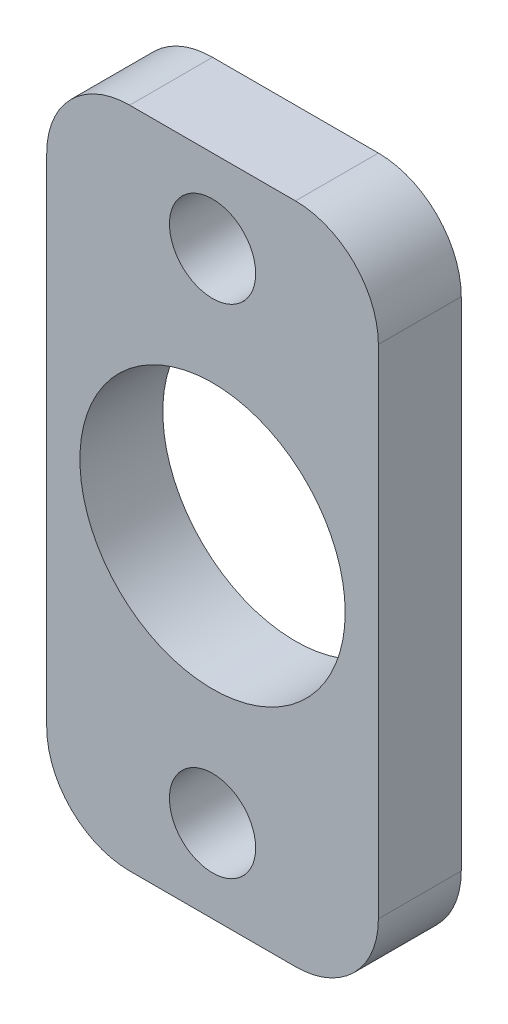
ISO-10303-21;
HEADER;
FILE_DESCRIPTION(('STEP AP214'),'2;1');
FILE_NAME('part.step','',(''),(''),'','','');
FILE_SCHEMA(('AUTOMOTIVE_DESIGN { 1 0 10303 214 1 1 1 1 }'));
ENDSEC;
DATA;
#1=APPLICATION_CONTEXT('core data for automotive mechanical design processes');
#2=APPLICATION_PROTOCOL_DEFINITION('international standard','automotive_design',2000,#1);
#3=PRODUCT_CONTEXT('',#1,'mechanical');
#4=PRODUCT('Part','Part','',(#3));
#5=PRODUCT_RELATED_PRODUCT_CATEGORY('part','',(#4));
#6=PRODUCT_DEFINITION_FORMATION('','',#4);
#7=PRODUCT_DEFINITION_CONTEXT('part definition',#1,'design');
#8=PRODUCT_DEFINITION('design','',#6,#7);
#9=PRODUCT_DEFINITION_SHAPE('','',#8);
#10=(LENGTH_UNIT() NAMED_UNIT(*) SI_UNIT(.MILLI.,.METRE.));
#11=(NAMED_UNIT(*) PLANE_ANGLE_UNIT() SI_UNIT($,.RADIAN.));
#12=(NAMED_UNIT(*) SI_UNIT($,.STERADIAN.) SOLID_ANGLE_UNIT());
#13=UNCERTAINTY_MEASURE_WITH_UNIT(LENGTH_MEASURE(1.E-05),#10,'distance_accuracy_value','');
#14=(GEOMETRIC_REPRESENTATION_CONTEXT(3) GLOBAL_UNCERTAINTY_ASSIGNED_CONTEXT((#13)) GLOBAL_UNIT_ASSIGNED_CONTEXT((#10,
#11,#12)) REPRESENTATION_CONTEXT('',''));
#15=CARTESIAN_POINT('',(0.,0.,0.));
#16=DIRECTION('',(0.,0.,1.));
#17=DIRECTION('',(1.,0.,0.));
#18=AXIS2_PLACEMENT_3D('',#15,#16,#17);
#19=CARTESIAN_POINT('',(0.,0.,2.5));
#20=DIRECTION('',(0.,0.,1.));
#21=DIRECTION('',(1.,0.,0.));
#22=AXIS2_PLACEMENT_3D('',#19,#20,#21);
#23=PLANE('',#22);
#24=CARTESIAN_POINT('',(0.,15.,2.5));
#25=DIRECTION('',(0.,0.,-1.));
#26=DIRECTION('',(1.,0.,0.));
#27=AXIS2_PLACEMENT_3D('',#24,#25,#26);
#28=CIRCLE('',#27,2.6);
#29=CARTESIAN_POINT('',(2.6,15.,2.5));
#30=VERTEX_POINT('',#29);
#31=EDGE_CURVE('E183',#30,#30,#28,.T.);
#32=ORIENTED_EDGE('',*,*,#31,.T.);
#33=EDGE_LOOP('',(#32));
#34=FACE_BOUND('',#33,.T.);
#35=CARTESIAN_POINT('',(0.,-15.,2.5));
#36=DIRECTION('',(0.,0.,1.));
#37=DIRECTION('',(1.,0.,0.));
#38=AXIS2_PLACEMENT_3D('',#35,#36,#37);
#39=CIRCLE('',#38,2.6);
#40=CARTESIAN_POINT('',(2.6,-15.,2.5));
#41=VERTEX_POINT('',#40);
#42=EDGE_CURVE('E177',#41,#41,#39,.T.);
#43=ORIENTED_EDGE('',*,*,#42,.F.);
#44=EDGE_LOOP('',(#43));
#45=FACE_BOUND('',#44,.T.);
#46=DIRECTION('',(0.,-1.,0.));
#47=VECTOR('',#46,1.);
#48=CARTESIAN_POINT('',(-10.,20.,2.5));
#49=LINE('',#48,#47);
#50=CARTESIAN_POINT('',(-10.,15.,2.5));
#51=VERTEX_POINT('',#50);
#52=CARTESIAN_POINT('',(-10.,-15.,2.5));
#53=VERTEX_POINT('',#52);
#54=EDGE_CURVE('E170',#51,#53,#49,.T.);
#55=ORIENTED_EDGE('',*,*,#54,.T.);
#56=CARTESIAN_POINT('',(-5.,-15.,2.5));
#57=DIRECTION('',(0.,0.,1.));
#58=DIRECTION('',(1.,0.,0.));
#59=AXIS2_PLACEMENT_3D('',#56,#57,#58);
#60=CIRCLE('',#59,5.);
#61=CARTESIAN_POINT('',(-5.,-20.,2.5));
#62=VERTEX_POINT('',#61);
#63=EDGE_CURVE('E147',#53,#62,#60,.T.);
#64=ORIENTED_EDGE('',*,*,#63,.T.);
#65=DIRECTION('',(1.,0.,0.));
#66=VECTOR('',#65,1.);
#67=CARTESIAN_POINT('',(-10.,-20.,2.5));
#68=LINE('',#67,#66);
#69=CARTESIAN_POINT('',(5.,-20.,2.5));
#70=VERTEX_POINT('',#69);
#71=EDGE_CURVE('E118',#62,#70,#68,.T.);
#72=ORIENTED_EDGE('',*,*,#71,.T.);
#73=CARTESIAN_POINT('',(5.,-15.,2.5));
#74=DIRECTION('',(0.,0.,1.));
#75=DIRECTION('',(1.,0.,0.));
#76=AXIS2_PLACEMENT_3D('',#73,#74,#75);
#77=CIRCLE('',#76,5.);
#78=CARTESIAN_POINT('',(10.,-15.,2.5));
#79=VERTEX_POINT('',#78);
#80=EDGE_CURVE('E142',#70,#79,#77,.T.);
#81=ORIENTED_EDGE('',*,*,#80,.T.);
#82=DIRECTION('',(0.,1.,0.));
#83=VECTOR('',#82,1.);
#84=CARTESIAN_POINT('',(10.,20.,2.5));
#85=LINE('',#84,#83);
#86=CARTESIAN_POINT('',(10.,15.,2.5));
#87=VERTEX_POINT('',#86);
#88=EDGE_CURVE('E125',#79,#87,#85,.T.);
#89=ORIENTED_EDGE('',*,*,#88,.T.);
#90=CARTESIAN_POINT('',(5.,15.,2.5));
#91=DIRECTION('',(0.,0.,1.));
#92=DIRECTION('',(1.,0.,0.));
#93=AXIS2_PLACEMENT_3D('',#90,#91,#92);
#94=CIRCLE('',#93,5.);
#95=CARTESIAN_POINT('',(5.,20.,2.5));
#96=VERTEX_POINT('',#95);
#97=EDGE_CURVE('E54',#87,#96,#94,.T.);
#98=ORIENTED_EDGE('',*,*,#97,.T.);
#99=DIRECTION('',(-1.,0.,0.));
#100=VECTOR('',#99,1.);
#101=CARTESIAN_POINT('',(-10.,20.,2.5));
#102=LINE('',#101,#100);
#103=CARTESIAN_POINT('',(-5.,20.,2.5));
#104=VERTEX_POINT('',#103);
#105=EDGE_CURVE('E128',#96,#104,#102,.T.);
#106=ORIENTED_EDGE('',*,*,#105,.T.);
#107=CARTESIAN_POINT('',(-5.,15.,2.5));
#108=DIRECTION('',(0.,0.,1.));
#109=DIRECTION('',(1.,0.,0.));
#110=AXIS2_PLACEMENT_3D('',#107,#108,#109);
#111=CIRCLE('',#110,5.);
#112=EDGE_CURVE('E145',#104,#51,#111,.T.);
#113=ORIENTED_EDGE('',*,*,#112,.T.);
#114=EDGE_LOOP('',(#55,#64,#72,#81,#89,#98,#106,#113));
#115=FACE_BOUND('',#114,.T.);
#116=CARTESIAN_POINT('',(0.,0.,2.5));
#117=DIRECTION('',(0.,0.,1.));
#118=DIRECTION('',(1.,0.,0.));
#119=AXIS2_PLACEMENT_3D('',#116,#117,#118);
#120=CIRCLE('',#119,8.);
#121=CARTESIAN_POINT('',(8.,0.,2.5));
#122=VERTEX_POINT('',#121);
#123=EDGE_CURVE('E163',#122,#122,#120,.T.);
#124=ORIENTED_EDGE('',*,*,#123,.F.);
#125=EDGE_LOOP('',(#124));
#126=FACE_BOUND('',#125,.T.);
#127=ADVANCED_FACE('F32',(#34,#45,#115,#126),#23,.T.);
#128=CARTESIAN_POINT('',(0.,0.,-2.5));
#129=DIRECTION('',(0.,0.,1.));
#130=DIRECTION('',(1.,0.,0.));
#131=AXIS2_PLACEMENT_3D('',#128,#129,#130);
#132=PLANE('',#131);
#133=CARTESIAN_POINT('',(0.,15.,-2.5));
#134=DIRECTION('',(0.,0.,-1.));
#135=DIRECTION('',(1.,0.,0.));
#136=AXIS2_PLACEMENT_3D('',#133,#134,#135);
#137=CIRCLE('',#136,2.6);
#138=CARTESIAN_POINT('',(2.6,15.,-2.5));
#139=VERTEX_POINT('',#138);
#140=EDGE_CURVE('E180',#139,#139,#137,.T.);
#141=ORIENTED_EDGE('',*,*,#140,.F.);
#142=EDGE_LOOP('',(#141));
#143=FACE_BOUND('',#142,.T.);
#144=CARTESIAN_POINT('',(0.,-15.,-2.5));
#145=DIRECTION('',(0.,0.,1.));
#146=DIRECTION('',(1.,0.,0.));
#147=AXIS2_PLACEMENT_3D('',#144,#145,#146);
#148=CIRCLE('',#147,2.6);
#149=CARTESIAN_POINT('',(2.6,-15.,-2.5));
#150=VERTEX_POINT('',#149);
#151=EDGE_CURVE('E175',#150,#150,#148,.T.);
#152=ORIENTED_EDGE('',*,*,#151,.T.);
#153=EDGE_LOOP('',(#152));
#154=FACE_BOUND('',#153,.T.);
#155=DIRECTION('',(1.,0.,0.));
#156=VECTOR('',#155,1.);
#157=CARTESIAN_POINT('',(-10.,-20.,-2.5));
#158=LINE('',#157,#156);
#159=CARTESIAN_POINT('',(-5.,-20.,-2.5));
#160=VERTEX_POINT('',#159);
#161=CARTESIAN_POINT('',(5.,-20.,-2.5));
#162=VERTEX_POINT('',#161);
#163=EDGE_CURVE('E115',#160,#162,#158,.T.);
#164=ORIENTED_EDGE('',*,*,#163,.F.);
#165=CARTESIAN_POINT('',(-5.,-15.,-2.5));
#166=DIRECTION('',(0.,0.,1.));
#167=DIRECTION('',(1.,0.,0.));
#168=AXIS2_PLACEMENT_3D('',#165,#166,#167);
#169=CIRCLE('',#168,5.);
#170=CARTESIAN_POINT('',(-10.,-15.,-2.5));
#171=VERTEX_POINT('',#170);
#172=EDGE_CURVE('E98',#160,#171,#169,.F.);
#173=ORIENTED_EDGE('',*,*,#172,.T.);
#174=DIRECTION('',(0.,-1.,0.));
#175=VECTOR('',#174,1.);
#176=CARTESIAN_POINT('',(-10.,20.,-2.5));
#177=LINE('',#176,#175);
#178=CARTESIAN_POINT('',(-10.,15.,-2.5));
#179=VERTEX_POINT('',#178);
#180=EDGE_CURVE('E126',#179,#171,#177,.T.);
#181=ORIENTED_EDGE('',*,*,#180,.F.);
#182=CARTESIAN_POINT('',(-5.,15.,-2.5));
#183=DIRECTION('',(0.,0.,1.));
#184=DIRECTION('',(1.,0.,0.));
#185=AXIS2_PLACEMENT_3D('',#182,#183,#184);
#186=CIRCLE('',#185,5.);
#187=CARTESIAN_POINT('',(-5.,20.,-2.5));
#188=VERTEX_POINT('',#187);
#189=EDGE_CURVE('E109',#179,#188,#186,.F.);
#190=ORIENTED_EDGE('',*,*,#189,.T.);
#191=DIRECTION('',(-1.,0.,0.));
#192=VECTOR('',#191,1.);
#193=CARTESIAN_POINT('',(-10.,20.,-2.5));
#194=LINE('',#193,#192);
#195=CARTESIAN_POINT('',(5.,20.,-2.5));
#196=VERTEX_POINT('',#195);
#197=EDGE_CURVE('E130',#196,#188,#194,.T.);
#198=ORIENTED_EDGE('',*,*,#197,.F.);
#199=CARTESIAN_POINT('',(5.,15.,-2.5));
#200=DIRECTION('',(0.,0.,1.));
#201=DIRECTION('',(1.,0.,0.));
#202=AXIS2_PLACEMENT_3D('',#199,#200,#201);
#203=CIRCLE('',#202,5.);
#204=CARTESIAN_POINT('',(10.,15.,-2.5));
#205=VERTEX_POINT('',#204);
#206=EDGE_CURVE('E136',#196,#205,#203,.F.);
#207=ORIENTED_EDGE('',*,*,#206,.T.);
#208=DIRECTION('',(0.,1.,0.));
#209=VECTOR('',#208,1.);
#210=CARTESIAN_POINT('',(10.,20.,-2.5));
#211=LINE('',#210,#209);
#212=CARTESIAN_POINT('',(10.,-15.,-2.5));
#213=VERTEX_POINT('',#212);
#214=EDGE_CURVE('E158',#213,#205,#211,.T.);
#215=ORIENTED_EDGE('',*,*,#214,.F.);
#216=CARTESIAN_POINT('',(5.,-15.,-2.5));
#217=DIRECTION('',(0.,0.,1.));
#218=DIRECTION('',(1.,0.,0.));
#219=AXIS2_PLACEMENT_3D('',#216,#217,#218);
#220=CIRCLE('',#219,5.);
#221=EDGE_CURVE('E119',#213,#162,#220,.F.);
#222=ORIENTED_EDGE('',*,*,#221,.T.);
#223=EDGE_LOOP('',(#164,#173,#181,#190,#198,#207,#215,#222));
#224=FACE_BOUND('',#223,.T.);
#225=CARTESIAN_POINT('',(0.,0.,-2.5));
#226=DIRECTION('',(0.,0.,1.));
#227=DIRECTION('',(1.,0.,0.));
#228=AXIS2_PLACEMENT_3D('',#225,#226,#227);
#229=CIRCLE('',#228,8.);
#230=CARTESIAN_POINT('',(8.,0.,-2.5));
#231=VERTEX_POINT('',#230);
#232=EDGE_CURVE('E166',#231,#231,#229,.T.);
#233=ORIENTED_EDGE('',*,*,#232,.T.);
#234=EDGE_LOOP('',(#233));
#235=FACE_BOUND('',#234,.T.);
#236=ADVANCED_FACE('F122',(#143,#154,#224,#235),#132,.F.);
#237=CARTESIAN_POINT('',(10.,20.,2.5));
#238=DIRECTION('',(-1.,0.,0.));
#239=DIRECTION('',(0.,-1.,0.));
#240=AXIS2_PLACEMENT_3D('',#237,#238,#239);
#241=PLANE('',#240);
#242=ORIENTED_EDGE('',*,*,#214,.T.);
#243=DIRECTION('',(0.,0.,-1.));
#244=VECTOR('',#243,1.);
#245=CARTESIAN_POINT('',(10.,15.,2.5));
#246=LINE('',#245,#244);
#247=EDGE_CURVE('E11',#205,#87,#246,.F.);
#248=ORIENTED_EDGE('',*,*,#247,.T.);
#249=ORIENTED_EDGE('',*,*,#88,.F.);
#250=DIRECTION('',(0.,0.,-1.));
#251=VECTOR('',#250,1.);
#252=CARTESIAN_POINT('',(10.,-15.,2.5));
#253=LINE('',#252,#251);
#254=EDGE_CURVE('E40',#79,#213,#253,.T.);
#255=ORIENTED_EDGE('',*,*,#254,.T.);
#256=EDGE_LOOP('',(#242,#248,#249,#255));
#257=FACE_BOUND('',#256,.T.);
#258=ADVANCED_FACE('F157',(#257),#241,.F.);
#259=CARTESIAN_POINT('',(-10.,20.,2.5));
#260=DIRECTION('',(0.,-1.,0.));
#261=DIRECTION('',(0.,0.,-1.));
#262=AXIS2_PLACEMENT_3D('',#259,#260,#261);
#263=PLANE('',#262);
#264=ORIENTED_EDGE('',*,*,#197,.T.);
#265=DIRECTION('',(0.,0.,-1.));
#266=VECTOR('',#265,1.);
#267=CARTESIAN_POINT('',(-5.,20.,2.5));
#268=LINE('',#267,#266);
#269=EDGE_CURVE('E47',#188,#104,#268,.F.);
#270=ORIENTED_EDGE('',*,*,#269,.T.);
#271=ORIENTED_EDGE('',*,*,#105,.F.);
#272=DIRECTION('',(0.,0.,-1.));
#273=VECTOR('',#272,1.);
#274=CARTESIAN_POINT('',(5.,20.,2.5));
#275=LINE('',#274,#273);
#276=EDGE_CURVE('E149',#96,#196,#275,.T.);
#277=ORIENTED_EDGE('',*,*,#276,.T.);
#278=EDGE_LOOP('',(#264,#270,#271,#277));
#279=FACE_BOUND('',#278,.T.);
#280=ADVANCED_FACE('F224',(#279),#263,.F.);
#281=CARTESIAN_POINT('',(-10.,20.,2.5));
#282=DIRECTION('',(1.,0.,0.));
#283=DIRECTION('',(0.,1.,0.));
#284=AXIS2_PLACEMENT_3D('',#281,#282,#283);
#285=PLANE('',#284);
#286=ORIENTED_EDGE('',*,*,#180,.T.);
#287=DIRECTION('',(0.,0.,-1.));
#288=VECTOR('',#287,1.);
#289=CARTESIAN_POINT('',(-10.,-15.,2.5));
#290=LINE('',#289,#288);
#291=EDGE_CURVE('E103',#171,#53,#290,.F.);
#292=ORIENTED_EDGE('',*,*,#291,.T.);
#293=ORIENTED_EDGE('',*,*,#54,.F.);
#294=DIRECTION('',(0.,0.,-1.));
#295=VECTOR('',#294,1.);
#296=CARTESIAN_POINT('',(-10.,15.,2.5));
#297=LINE('',#296,#295);
#298=EDGE_CURVE('E108',#51,#179,#297,.T.);
#299=ORIENTED_EDGE('',*,*,#298,.T.);
#300=EDGE_LOOP('',(#286,#292,#293,#299));
#301=FACE_BOUND('',#300,.T.);
#302=ADVANCED_FACE('F218',(#301),#285,.F.);
#303=CARTESIAN_POINT('',(-10.,-20.,2.5));
#304=DIRECTION('',(0.,1.,0.));
#305=DIRECTION('',(0.,0.,1.));
#306=AXIS2_PLACEMENT_3D('',#303,#304,#305);
#307=PLANE('',#306);
#308=ORIENTED_EDGE('',*,*,#71,.F.);
#309=DIRECTION('',(0.,0.,-1.));
#310=VECTOR('',#309,1.);
#311=CARTESIAN_POINT('',(-5.,-20.,2.5));
#312=LINE('',#311,#310);
#313=EDGE_CURVE('E102',#62,#160,#312,.T.);
#314=ORIENTED_EDGE('',*,*,#313,.T.);
#315=ORIENTED_EDGE('',*,*,#163,.T.);
#316=DIRECTION('',(0.,0.,-1.));
#317=VECTOR('',#316,1.);
#318=CARTESIAN_POINT('',(5.,-20.,2.5));
#319=LINE('',#318,#317);
#320=EDGE_CURVE('E120',#162,#70,#319,.F.);
#321=ORIENTED_EDGE('',*,*,#320,.T.);
#322=EDGE_LOOP('',(#308,#314,#315,#321));
#323=FACE_BOUND('',#322,.T.);
#324=ADVANCED_FACE('F114',(#323),#307,.F.);
#325=CARTESIAN_POINT('',(0.,0.,2.5));
#326=DIRECTION('',(0.,0.,-1.));
#327=DIRECTION('',(-1.,0.,0.));
#328=AXIS2_PLACEMENT_3D('',#325,#326,#327);
#329=CYLINDRICAL_SURFACE('',#328,8.);
#330=ORIENTED_EDGE('',*,*,#123,.T.);
#331=EDGE_LOOP('',(#330));
#332=FACE_BOUND('',#331,.T.);
#333=ORIENTED_EDGE('',*,*,#232,.F.);
#334=EDGE_LOOP('',(#333));
#335=FACE_BOUND('',#334,.T.);
#336=ADVANCED_FACE('F200',(#332,#335),#329,.F.);
#337=CARTESIAN_POINT('',(0.,-15.,-2.5));
#338=DIRECTION('',(0.,0.,1.));
#339=DIRECTION('',(1.,0.,0.));
#340=AXIS2_PLACEMENT_3D('',#337,#338,#339);
#341=CYLINDRICAL_SURFACE('',#340,2.6);
#342=ORIENTED_EDGE('',*,*,#151,.F.);
#343=EDGE_LOOP('',(#342));
#344=FACE_BOUND('',#343,.T.);
#345=ORIENTED_EDGE('',*,*,#42,.T.);
#346=EDGE_LOOP('',(#345));
#347=FACE_BOUND('',#346,.T.);
#348=ADVANCED_FACE('F197',(#344,#347),#341,.F.);
#349=CARTESIAN_POINT('',(0.,15.,-2.5));
#350=DIRECTION('',(0.,0.,1.));
#351=DIRECTION('',(1.,0.,0.));
#352=AXIS2_PLACEMENT_3D('',#349,#350,#351);
#353=CYLINDRICAL_SURFACE('',#352,2.6);
#354=ORIENTED_EDGE('',*,*,#140,.T.);
#355=EDGE_LOOP('',(#354));
#356=FACE_BOUND('',#355,.T.);
#357=ORIENTED_EDGE('',*,*,#31,.F.);
#358=EDGE_LOOP('',(#357));
#359=FACE_BOUND('',#358,.T.);
#360=ADVANCED_FACE('F189',(#356,#359),#353,.F.);
#361=CARTESIAN_POINT('',(-5.,-15.,2.5));
#362=DIRECTION('',(0.,0.,-1.));
#363=DIRECTION('',(-1.,0.,0.));
#364=AXIS2_PLACEMENT_3D('',#361,#362,#363);
#365=CYLINDRICAL_SURFACE('',#364,5.);
#366=ORIENTED_EDGE('',*,*,#63,.F.);
#367=ORIENTED_EDGE('',*,*,#291,.F.);
#368=ORIENTED_EDGE('',*,*,#172,.F.);
#369=ORIENTED_EDGE('',*,*,#313,.F.);
#370=EDGE_LOOP('',(#366,#367,#368,#369));
#371=FACE_BOUND('',#370,.T.);
#372=ADVANCED_FACE('F101',(#371),#365,.T.);
#373=CARTESIAN_POINT('',(-5.,15.,2.5));
#374=DIRECTION('',(0.,0.,-1.));
#375=DIRECTION('',(-1.,0.,0.));
#376=AXIS2_PLACEMENT_3D('',#373,#374,#375);
#377=CYLINDRICAL_SURFACE('',#376,5.);
#378=ORIENTED_EDGE('',*,*,#112,.F.);
#379=ORIENTED_EDGE('',*,*,#269,.F.);
#380=ORIENTED_EDGE('',*,*,#189,.F.);
#381=ORIENTED_EDGE('',*,*,#298,.F.);
#382=EDGE_LOOP('',(#378,#379,#380,#381));
#383=FACE_BOUND('',#382,.T.);
#384=ADVANCED_FACE('F232',(#383),#377,.T.);
#385=CARTESIAN_POINT('',(5.,15.,2.5));
#386=DIRECTION('',(0.,0.,-1.));
#387=DIRECTION('',(-1.,0.,0.));
#388=AXIS2_PLACEMENT_3D('',#385,#386,#387);
#389=CYLINDRICAL_SURFACE('',#388,5.);
#390=ORIENTED_EDGE('',*,*,#97,.F.);
#391=ORIENTED_EDGE('',*,*,#247,.F.);
#392=ORIENTED_EDGE('',*,*,#206,.F.);
#393=ORIENTED_EDGE('',*,*,#276,.F.);
#394=EDGE_LOOP('',(#390,#391,#392,#393));
#395=FACE_BOUND('',#394,.T.);
#396=ADVANCED_FACE('F234',(#395),#389,.T.);
#397=CARTESIAN_POINT('',(5.,-15.,2.5));
#398=DIRECTION('',(0.,0.,-1.));
#399=DIRECTION('',(-1.,0.,0.));
#400=AXIS2_PLACEMENT_3D('',#397,#398,#399);
#401=CYLINDRICAL_SURFACE('',#400,5.);
#402=ORIENTED_EDGE('',*,*,#80,.F.);
#403=ORIENTED_EDGE('',*,*,#320,.F.);
#404=ORIENTED_EDGE('',*,*,#221,.F.);
#405=ORIENTED_EDGE('',*,*,#254,.F.);
#406=EDGE_LOOP('',(#402,#403,#404,#405));
#407=FACE_BOUND('',#406,.T.);
#408=ADVANCED_FACE('F34',(#407),#401,.T.);
#409=CLOSED_SHELL('',(#127,#236,#258,#280,#302,#324,#336,#348,#360,#372,#384,#396,#408));
#410=MANIFOLD_SOLID_BREP('B2',#409);
#411=ADVANCED_BREP_SHAPE_REPRESENTATION('',(#18,#410),#14);
#412=SHAPE_DEFINITION_REPRESENTATION(#9,#411);
ENDSEC;
END-ISO-10303-21;
